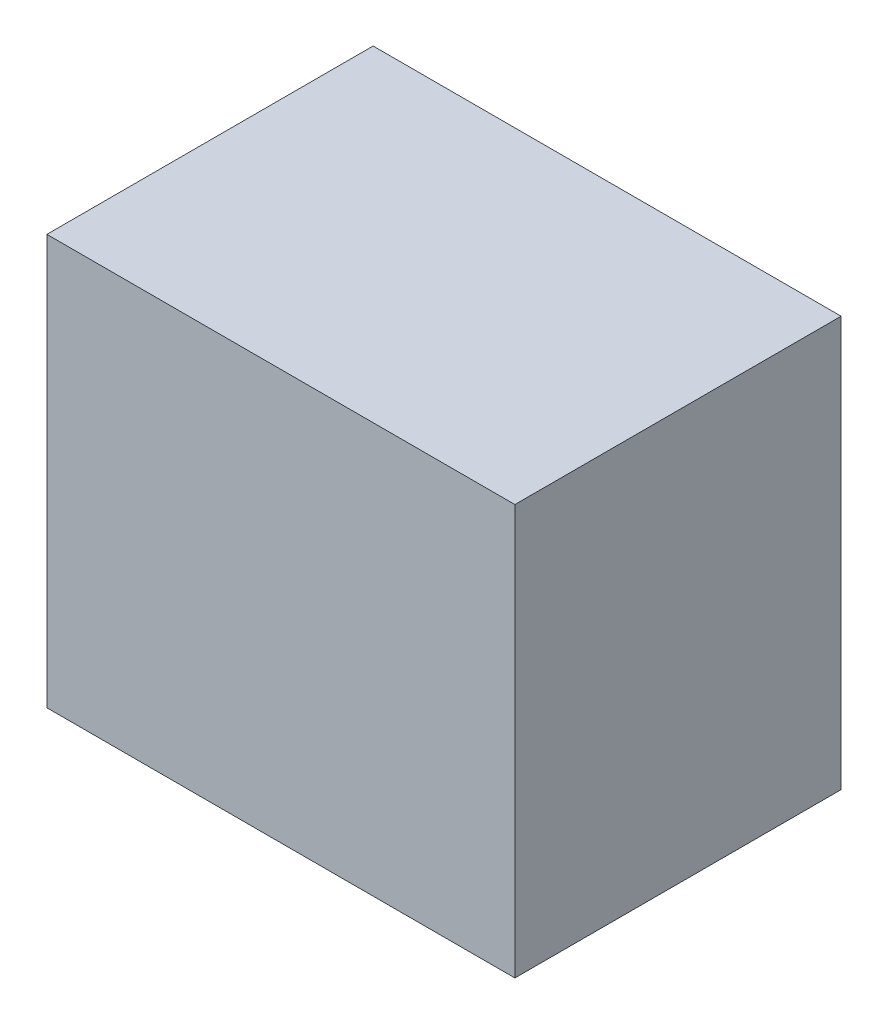
ISO-10303-21;
HEADER;
FILE_DESCRIPTION(('STEP AP214'),'2;1');
FILE_NAME('part.step','',(''),(''),'','','');
FILE_SCHEMA(('AUTOMOTIVE_DESIGN { 1 0 10303 214 1 1 1 1 }'));
ENDSEC;
DATA;
#1=APPLICATION_CONTEXT('core data for automotive mechanical design processes');
#2=APPLICATION_PROTOCOL_DEFINITION('international standard','automotive_design',2000,#1);
#3=PRODUCT_CONTEXT('',#1,'mechanical');
#4=PRODUCT('Part','Part','',(#3));
#5=PRODUCT_RELATED_PRODUCT_CATEGORY('part','',(#4));
#6=PRODUCT_DEFINITION_FORMATION('','',#4);
#7=PRODUCT_DEFINITION_CONTEXT('part definition',#1,'design');
#8=PRODUCT_DEFINITION('design','',#6,#7);
#9=PRODUCT_DEFINITION_SHAPE('','',#8);
#10=(LENGTH_UNIT() NAMED_UNIT(*) SI_UNIT(.MILLI.,.METRE.));
#11=(NAMED_UNIT(*) PLANE_ANGLE_UNIT() SI_UNIT($,.RADIAN.));
#12=(NAMED_UNIT(*) SI_UNIT($,.STERADIAN.) SOLID_ANGLE_UNIT());
#13=UNCERTAINTY_MEASURE_WITH_UNIT(LENGTH_MEASURE(1.E-05),#10,'distance_accuracy_value','');
#14=(GEOMETRIC_REPRESENTATION_CONTEXT(3) GLOBAL_UNCERTAINTY_ASSIGNED_CONTEXT((#13)) GLOBAL_UNIT_ASSIGNED_CONTEXT((#10,
#11,#12)) REPRESENTATION_CONTEXT('',''));
#15=CARTESIAN_POINT('',(0.,0.,0.));
#16=DIRECTION('',(0.,0.,1.));
#17=DIRECTION('',(1.,0.,0.));
#18=AXIS2_PLACEMENT_3D('',#15,#16,#17);
#19=CARTESIAN_POINT('',(0.,0.,20.066));
#20=DIRECTION('',(1.,0.,0.));
#21=DIRECTION('',(0.,0.,-1.));
#22=AXIS2_PLACEMENT_3D('',#19,#20,#21);
#23=PLANE('',#22);
#24=DIRECTION('',(0.,-1.,0.));
#25=VECTOR('',#24,1.);
#26=CARTESIAN_POINT('',(0.,0.,0.));
#27=LINE('',#26,#25);
#28=CARTESIAN_POINT('',(0.,25.2209533879637,0.));
#29=VERTEX_POINT('',#28);
#30=CARTESIAN_POINT('',(0.,0.,0.));
#31=VERTEX_POINT('',#30);
#32=EDGE_CURVE('E107',#29,#31,#27,.T.);
#33=ORIENTED_EDGE('',*,*,#32,.T.);
#34=DIRECTION('',(0.,0.,-1.));
#35=VECTOR('',#34,1.);
#36=CARTESIAN_POINT('',(0.,0.,20.066));
#37=LINE('',#36,#35);
#38=CARTESIAN_POINT('',(0.,0.,20.066));
#39=VERTEX_POINT('',#38);
#40=EDGE_CURVE('E11',#39,#31,#37,.T.);
#41=ORIENTED_EDGE('',*,*,#40,.F.);
#42=DIRECTION('',(0.,-1.,0.));
#43=VECTOR('',#42,1.);
#44=CARTESIAN_POINT('',(0.,0.,20.066));
#45=LINE('',#44,#43);
#46=CARTESIAN_POINT('',(0.,25.2209533879637,20.066));
#47=VERTEX_POINT('',#46);
#48=EDGE_CURVE('E94',#47,#39,#45,.T.);
#49=ORIENTED_EDGE('',*,*,#48,.F.);
#50=DIRECTION('',(0.,0.,-1.));
#51=VECTOR('',#50,1.);
#52=CARTESIAN_POINT('',(0.,25.2209533879637,20.066));
#53=LINE('',#52,#51);
#54=EDGE_CURVE('E103',#47,#29,#53,.T.);
#55=ORIENTED_EDGE('',*,*,#54,.T.);
#56=EDGE_LOOP('',(#33,#41,#49,#55));
#57=FACE_BOUND('',#56,.T.);
#58=ADVANCED_FACE('F43',(#57),#23,.F.);
#59=CARTESIAN_POINT('',(0.,0.,20.066));
#60=DIRECTION('',(0.,1.,0.));
#61=DIRECTION('',(0.,0.,1.));
#62=AXIS2_PLACEMENT_3D('',#59,#60,#61);
#63=PLANE('',#62);
#64=DIRECTION('',(1.,0.,0.));
#65=VECTOR('',#64,1.);
#66=CARTESIAN_POINT('',(0.,0.,0.));
#67=LINE('',#66,#65);
#68=CARTESIAN_POINT('',(28.7862190501366,0.,0.));
#69=VERTEX_POINT('',#68);
#70=EDGE_CURVE('E98',#31,#69,#67,.T.);
#71=ORIENTED_EDGE('',*,*,#70,.T.);
#72=DIRECTION('',(0.,0.,-1.));
#73=VECTOR('',#72,1.);
#74=CARTESIAN_POINT('',(28.7862190501366,0.,20.066));
#75=LINE('',#74,#73);
#76=CARTESIAN_POINT('',(28.7862190501366,0.,20.066));
#77=VERTEX_POINT('',#76);
#78=EDGE_CURVE('E51',#77,#69,#75,.T.);
#79=ORIENTED_EDGE('',*,*,#78,.F.);
#80=DIRECTION('',(1.,0.,0.));
#81=VECTOR('',#80,1.);
#82=CARTESIAN_POINT('',(0.,0.,20.066));
#83=LINE('',#82,#81);
#84=EDGE_CURVE('E89',#39,#77,#83,.T.);
#85=ORIENTED_EDGE('',*,*,#84,.F.);
#86=ORIENTED_EDGE('',*,*,#40,.T.);
#87=EDGE_LOOP('',(#71,#79,#85,#86));
#88=FACE_BOUND('',#87,.T.);
#89=ADVANCED_FACE('F97',(#88),#63,.F.);
#90=CARTESIAN_POINT('',(28.7862190501366,0.,20.066));
#91=DIRECTION('',(-1.,0.,0.));
#92=DIRECTION('',(0.,0.,1.));
#93=AXIS2_PLACEMENT_3D('',#90,#91,#92);
#94=PLANE('',#93);
#95=DIRECTION('',(0.,1.,0.));
#96=VECTOR('',#95,1.);
#97=CARTESIAN_POINT('',(28.7862190501366,0.,0.));
#98=LINE('',#97,#96);
#99=CARTESIAN_POINT('',(28.7862190501366,25.2209533879637,0.));
#100=VERTEX_POINT('',#99);
#101=EDGE_CURVE('E76',#69,#100,#98,.T.);
#102=ORIENTED_EDGE('',*,*,#101,.T.);
#103=DIRECTION('',(0.,0.,-1.));
#104=VECTOR('',#103,1.);
#105=CARTESIAN_POINT('',(28.7862190501366,25.2209533879637,20.066));
#106=LINE('',#105,#104);
#107=CARTESIAN_POINT('',(28.7862190501366,25.2209533879637,20.066));
#108=VERTEX_POINT('',#107);
#109=EDGE_CURVE('E99',#108,#100,#106,.T.);
#110=ORIENTED_EDGE('',*,*,#109,.F.);
#111=DIRECTION('',(0.,1.,0.));
#112=VECTOR('',#111,1.);
#113=CARTESIAN_POINT('',(28.7862190501366,0.,20.066));
#114=LINE('',#113,#112);
#115=EDGE_CURVE('E92',#77,#108,#114,.T.);
#116=ORIENTED_EDGE('',*,*,#115,.F.);
#117=ORIENTED_EDGE('',*,*,#78,.T.);
#118=EDGE_LOOP('',(#102,#110,#116,#117));
#119=FACE_BOUND('',#118,.T.);
#120=ADVANCED_FACE('F100',(#119),#94,.F.);
#121=CARTESIAN_POINT('',(0.,25.2209533879637,20.066));
#122=DIRECTION('',(0.,-1.,0.));
#123=DIRECTION('',(0.,0.,-1.));
#124=AXIS2_PLACEMENT_3D('',#121,#122,#123);
#125=PLANE('',#124);
#126=DIRECTION('',(-1.,0.,0.));
#127=VECTOR('',#126,1.);
#128=CARTESIAN_POINT('',(0.,25.2209533879637,0.));
#129=LINE('',#128,#127);
#130=EDGE_CURVE('E82',#100,#29,#129,.T.);
#131=ORIENTED_EDGE('',*,*,#130,.T.);
#132=ORIENTED_EDGE('',*,*,#54,.F.);
#133=DIRECTION('',(-1.,0.,0.));
#134=VECTOR('',#133,1.);
#135=CARTESIAN_POINT('',(0.,25.2209533879637,20.066));
#136=LINE('',#135,#134);
#137=EDGE_CURVE('E59',#108,#47,#136,.T.);
#138=ORIENTED_EDGE('',*,*,#137,.F.);
#139=ORIENTED_EDGE('',*,*,#109,.T.);
#140=EDGE_LOOP('',(#131,#132,#138,#139));
#141=FACE_BOUND('',#140,.T.);
#142=ADVANCED_FACE('F114',(#141),#125,.F.);
#143=CARTESIAN_POINT('',(0.,0.,20.066));
#144=DIRECTION('',(0.,0.,-1.));
#145=DIRECTION('',(-1.,0.,0.));
#146=AXIS2_PLACEMENT_3D('',#143,#144,#145);
#147=PLANE('',#146);
#148=ORIENTED_EDGE('',*,*,#48,.T.);
#149=ORIENTED_EDGE('',*,*,#84,.T.);
#150=ORIENTED_EDGE('',*,*,#115,.T.);
#151=ORIENTED_EDGE('',*,*,#137,.T.);
#152=EDGE_LOOP('',(#148,#149,#150,#151));
#153=FACE_BOUND('',#152,.T.);
#154=ADVANCED_FACE('F90',(#153),#147,.F.);
#155=CARTESIAN_POINT('',(0.,0.,0.));
#156=DIRECTION('',(0.,0.,-1.));
#157=DIRECTION('',(-1.,0.,0.));
#158=AXIS2_PLACEMENT_3D('',#155,#156,#157);
#159=PLANE('',#158);
#160=ORIENTED_EDGE('',*,*,#32,.F.);
#161=ORIENTED_EDGE('',*,*,#130,.F.);
#162=ORIENTED_EDGE('',*,*,#101,.F.);
#163=ORIENTED_EDGE('',*,*,#70,.F.);
#164=EDGE_LOOP('',(#160,#161,#162,#163));
#165=FACE_BOUND('',#164,.T.);
#166=ADVANCED_FACE('F117',(#165),#159,.T.);
#167=CLOSED_SHELL('',(#58,#89,#120,#142,#154,#166));
#168=MANIFOLD_SOLID_BREP('B2',#167);
#169=ADVANCED_BREP_SHAPE_REPRESENTATION('',(#18,#168),#14);
#170=SHAPE_DEFINITION_REPRESENTATION(#9,#169);
ENDSEC;
END-ISO-10303-21;
